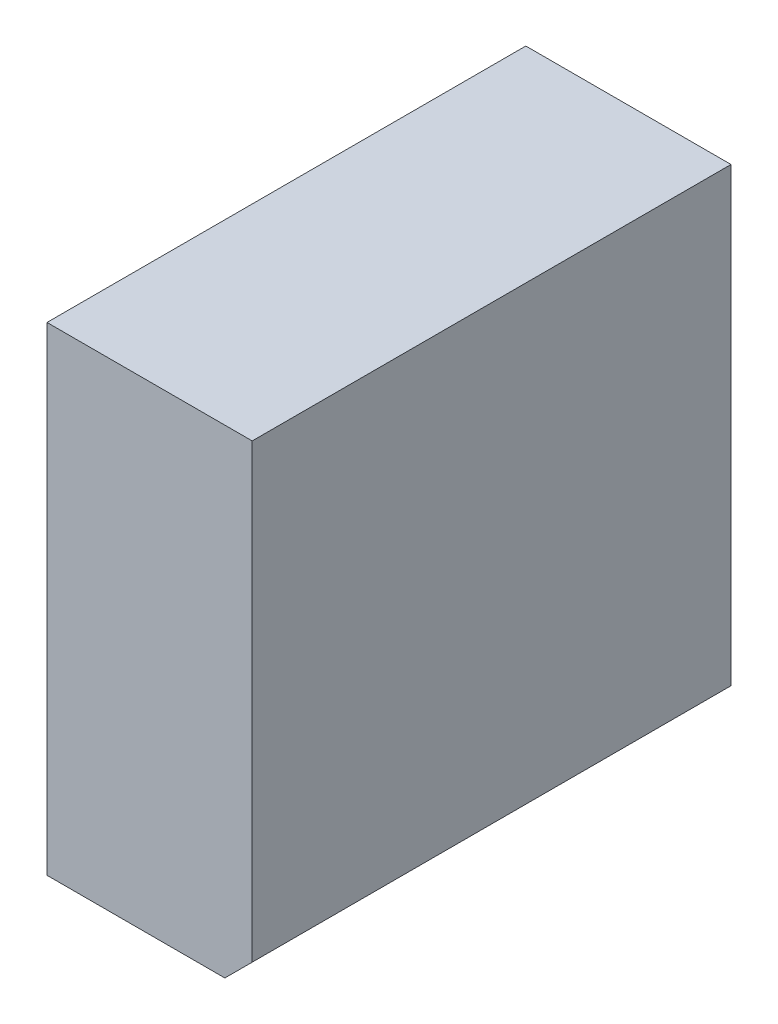
ISO-10303-21;
HEADER;
FILE_DESCRIPTION(('STEP AP214'),'2;1');
FILE_NAME('part.step','',(''),(''),'','','');
FILE_SCHEMA(('AUTOMOTIVE_DESIGN { 1 0 10303 214 1 1 1 1 }'));
ENDSEC;
DATA;
#1=APPLICATION_CONTEXT('core data for automotive mechanical design processes');
#2=APPLICATION_PROTOCOL_DEFINITION('international standard','automotive_design',2000,#1);
#3=PRODUCT_CONTEXT('',#1,'mechanical');
#4=PRODUCT('Part','Part','',(#3));
#5=PRODUCT_RELATED_PRODUCT_CATEGORY('part','',(#4));
#6=PRODUCT_DEFINITION_FORMATION('','',#4);
#7=PRODUCT_DEFINITION_CONTEXT('part definition',#1,'design');
#8=PRODUCT_DEFINITION('design','',#6,#7);
#9=PRODUCT_DEFINITION_SHAPE('','',#8);
#10=(LENGTH_UNIT() NAMED_UNIT(*) SI_UNIT(.MILLI.,.METRE.));
#11=(NAMED_UNIT(*) PLANE_ANGLE_UNIT() SI_UNIT($,.RADIAN.));
#12=(NAMED_UNIT(*) SI_UNIT($,.STERADIAN.) SOLID_ANGLE_UNIT());
#13=UNCERTAINTY_MEASURE_WITH_UNIT(LENGTH_MEASURE(1.E-05),#10,'distance_accuracy_value','');
#14=(GEOMETRIC_REPRESENTATION_CONTEXT(3) GLOBAL_UNCERTAINTY_ASSIGNED_CONTEXT((#13)) GLOBAL_UNIT_ASSIGNED_CONTEXT((#10,
#11,#12)) REPRESENTATION_CONTEXT('',''));
#15=CARTESIAN_POINT('',(0.,0.,0.));
#16=DIRECTION('',(0.,0.,1.));
#17=DIRECTION('',(1.,0.,0.));
#18=AXIS2_PLACEMENT_3D('',#15,#16,#17);
#19=CARTESIAN_POINT('',(0.,0.,88.9));
#20=DIRECTION('',(1.,0.,0.));
#21=DIRECTION('',(0.,0.,-1.));
#22=AXIS2_PLACEMENT_3D('',#19,#20,#21);
#23=PLANE('',#22);
#24=DIRECTION('',(0.,-1.,0.));
#25=VECTOR('',#24,1.);
#26=CARTESIAN_POINT('',(0.,0.,0.));
#27=LINE('',#26,#25);
#28=CARTESIAN_POINT('',(0.,88.9,0.));
#29=VERTEX_POINT('',#28);
#30=CARTESIAN_POINT('',(0.,0.,0.));
#31=VERTEX_POINT('',#30);
#32=EDGE_CURVE('E99',#29,#31,#27,.T.);
#33=ORIENTED_EDGE('',*,*,#32,.T.);
#34=DIRECTION('',(0.,0.,-1.));
#35=VECTOR('',#34,1.);
#36=CARTESIAN_POINT('',(0.,0.,88.9));
#37=LINE('',#36,#35);
#38=CARTESIAN_POINT('',(0.,0.,88.9));
#39=VERTEX_POINT('',#38);
#40=EDGE_CURVE('E82',#39,#31,#37,.T.);
#41=ORIENTED_EDGE('',*,*,#40,.F.);
#42=DIRECTION('',(0.,-1.,0.));
#43=VECTOR('',#42,1.);
#44=CARTESIAN_POINT('',(0.,0.,88.9));
#45=LINE('',#44,#43);
#46=CARTESIAN_POINT('',(0.,88.9,88.9));
#47=VERTEX_POINT('',#46);
#48=EDGE_CURVE('E87',#47,#39,#45,.T.);
#49=ORIENTED_EDGE('',*,*,#48,.F.);
#50=DIRECTION('',(0.,0.,-1.));
#51=VECTOR('',#50,1.);
#52=CARTESIAN_POINT('',(0.,88.9,88.9));
#53=LINE('',#52,#51);
#54=EDGE_CURVE('E106',#47,#29,#53,.T.);
#55=ORIENTED_EDGE('',*,*,#54,.T.);
#56=EDGE_LOOP('',(#33,#41,#49,#55));
#57=FACE_BOUND('',#56,.T.);
#58=ADVANCED_FACE('F35',(#57),#23,.F.);
#59=CARTESIAN_POINT('',(0.,0.,88.9));
#60=DIRECTION('',(0.,1.,0.));
#61=DIRECTION('',(0.,0.,1.));
#62=AXIS2_PLACEMENT_3D('',#59,#60,#61);
#63=PLANE('',#62);
#64=DIRECTION('',(1.,0.,0.));
#65=VECTOR('',#64,1.);
#66=CARTESIAN_POINT('',(0.,0.,0.));
#67=LINE('',#66,#65);
#68=CARTESIAN_POINT('',(33.02,0.,0.));
#69=VERTEX_POINT('',#68);
#70=EDGE_CURVE('E114',#31,#69,#67,.T.);
#71=ORIENTED_EDGE('',*,*,#70,.T.);
#72=DIRECTION('',(0.,0.,1.));
#73=VECTOR('',#72,1.);
#74=CARTESIAN_POINT('',(33.02,0.,88.9));
#75=LINE('',#74,#73);
#76=CARTESIAN_POINT('',(33.02,0.,88.9));
#77=VERTEX_POINT('',#76);
#78=EDGE_CURVE('E43',#69,#77,#75,.T.);
#79=ORIENTED_EDGE('',*,*,#78,.T.);
#80=DIRECTION('',(1.,0.,0.));
#81=VECTOR('',#80,1.);
#82=CARTESIAN_POINT('',(0.,0.,88.9));
#83=LINE('',#82,#81);
#84=EDGE_CURVE('E78',#39,#77,#83,.T.);
#85=ORIENTED_EDGE('',*,*,#84,.F.);
#86=ORIENTED_EDGE('',*,*,#40,.T.);
#87=EDGE_LOOP('',(#71,#79,#85,#86));
#88=FACE_BOUND('',#87,.T.);
#89=ADVANCED_FACE('F80',(#88),#63,.F.);
#90=CARTESIAN_POINT('',(38.1,0.,88.9));
#91=DIRECTION('',(-1.,0.,0.));
#92=DIRECTION('',(0.,0.,1.));
#93=AXIS2_PLACEMENT_3D('',#90,#91,#92);
#94=PLANE('',#93);
#95=DIRECTION('',(0.,1.,0.));
#96=VECTOR('',#95,1.);
#97=CARTESIAN_POINT('',(38.1,0.,88.9));
#98=LINE('',#97,#96);
#99=CARTESIAN_POINT('',(38.1,5.08,88.9));
#100=VERTEX_POINT('',#99);
#101=CARTESIAN_POINT('',(38.1,88.9,88.9));
#102=VERTEX_POINT('',#101);
#103=EDGE_CURVE('E86',#100,#102,#98,.T.);
#104=ORIENTED_EDGE('',*,*,#103,.F.);
#105=DIRECTION('',(0.,0.,-1.));
#106=VECTOR('',#105,1.);
#107=CARTESIAN_POINT('',(38.1,5.08,88.9));
#108=LINE('',#107,#106);
#109=CARTESIAN_POINT('',(38.1,5.08,0.));
#110=VERTEX_POINT('',#109);
#111=EDGE_CURVE('E100',#100,#110,#108,.T.);
#112=ORIENTED_EDGE('',*,*,#111,.T.);
#113=DIRECTION('',(0.,1.,0.));
#114=VECTOR('',#113,1.);
#115=CARTESIAN_POINT('',(38.1,0.,0.));
#116=LINE('',#115,#114);
#117=CARTESIAN_POINT('',(38.1,88.9,0.));
#118=VERTEX_POINT('',#117);
#119=EDGE_CURVE('E112',#110,#118,#116,.T.);
#120=ORIENTED_EDGE('',*,*,#119,.T.);
#121=DIRECTION('',(0.,0.,-1.));
#122=VECTOR('',#121,1.);
#123=CARTESIAN_POINT('',(38.1,88.9,88.9));
#124=LINE('',#123,#122);
#125=EDGE_CURVE('E101',#102,#118,#124,.T.);
#126=ORIENTED_EDGE('',*,*,#125,.F.);
#127=EDGE_LOOP('',(#104,#112,#120,#126));
#128=FACE_BOUND('',#127,.T.);
#129=ADVANCED_FACE('F122',(#128),#94,.F.);
#130=CARTESIAN_POINT('',(0.,88.9,88.9));
#131=DIRECTION('',(0.,-1.,0.));
#132=DIRECTION('',(0.,0.,-1.));
#133=AXIS2_PLACEMENT_3D('',#130,#131,#132);
#134=PLANE('',#133);
#135=DIRECTION('',(-1.,0.,0.));
#136=VECTOR('',#135,1.);
#137=CARTESIAN_POINT('',(0.,88.9,0.));
#138=LINE('',#137,#136);
#139=EDGE_CURVE('E96',#118,#29,#138,.T.);
#140=ORIENTED_EDGE('',*,*,#139,.T.);
#141=ORIENTED_EDGE('',*,*,#54,.F.);
#142=DIRECTION('',(-1.,0.,0.));
#143=VECTOR('',#142,1.);
#144=CARTESIAN_POINT('',(0.,88.9,88.9));
#145=LINE('',#144,#143);
#146=EDGE_CURVE('E92',#102,#47,#145,.T.);
#147=ORIENTED_EDGE('',*,*,#146,.F.);
#148=ORIENTED_EDGE('',*,*,#125,.T.);
#149=EDGE_LOOP('',(#140,#141,#147,#148));
#150=FACE_BOUND('',#149,.T.);
#151=ADVANCED_FACE('F125',(#150),#134,.F.);
#152=CARTESIAN_POINT('',(0.,0.,88.9));
#153=DIRECTION('',(0.,0.,-1.));
#154=DIRECTION('',(-1.,0.,0.));
#155=AXIS2_PLACEMENT_3D('',#152,#153,#154);
#156=PLANE('',#155);
#157=ORIENTED_EDGE('',*,*,#84,.T.);
#158=DIRECTION('',(-0.707106781186548,-0.707106781186547,0.));
#159=VECTOR('',#158,1.);
#160=CARTESIAN_POINT('',(38.1,5.08,88.9));
#161=LINE('',#160,#159);
#162=EDGE_CURVE('E11',#77,#100,#161,.F.);
#163=ORIENTED_EDGE('',*,*,#162,.T.);
#164=ORIENTED_EDGE('',*,*,#103,.T.);
#165=ORIENTED_EDGE('',*,*,#146,.T.);
#166=ORIENTED_EDGE('',*,*,#48,.T.);
#167=EDGE_LOOP('',(#157,#163,#164,#165,#166));
#168=FACE_BOUND('',#167,.T.);
#169=ADVANCED_FACE('F90',(#168),#156,.F.);
#170=CARTESIAN_POINT('',(0.,0.,0.));
#171=DIRECTION('',(0.,0.,-1.));
#172=DIRECTION('',(-1.,0.,0.));
#173=AXIS2_PLACEMENT_3D('',#170,#171,#172);
#174=PLANE('',#173);
#175=ORIENTED_EDGE('',*,*,#119,.F.);
#176=DIRECTION('',(0.707106781186548,0.707106781186547,0.));
#177=VECTOR('',#176,1.);
#178=CARTESIAN_POINT('',(16.5099999999999,-16.51,0.));
#179=LINE('',#178,#177);
#180=EDGE_CURVE('E57',#110,#69,#179,.F.);
#181=ORIENTED_EDGE('',*,*,#180,.T.);
#182=ORIENTED_EDGE('',*,*,#70,.F.);
#183=ORIENTED_EDGE('',*,*,#32,.F.);
#184=ORIENTED_EDGE('',*,*,#139,.F.);
#185=EDGE_LOOP('',(#175,#181,#182,#183,#184));
#186=FACE_BOUND('',#185,.T.);
#187=ADVANCED_FACE('F126',(#186),#174,.T.);
#188=CARTESIAN_POINT('',(38.1,5.08,88.9));
#189=DIRECTION('',(-0.707106781186547,0.707106781186548,0.));
#190=DIRECTION('',(0.,0.,-1.));
#191=AXIS2_PLACEMENT_3D('',#188,#189,#190);
#192=PLANE('',#191);
#193=ORIENTED_EDGE('',*,*,#162,.F.);
#194=ORIENTED_EDGE('',*,*,#78,.F.);
#195=ORIENTED_EDGE('',*,*,#180,.F.);
#196=ORIENTED_EDGE('',*,*,#111,.F.);
#197=EDGE_LOOP('',(#193,#194,#195,#196));
#198=FACE_BOUND('',#197,.T.);
#199=ADVANCED_FACE('F37',(#198),#192,.F.);
#200=CLOSED_SHELL('',(#58,#89,#129,#151,#169,#187,#199));
#201=MANIFOLD_SOLID_BREP('B2',#200);
#202=ADVANCED_BREP_SHAPE_REPRESENTATION('',(#18,#201),#14);
#203=SHAPE_DEFINITION_REPRESENTATION(#9,#202);
ENDSEC;
END-ISO-10303-21;
